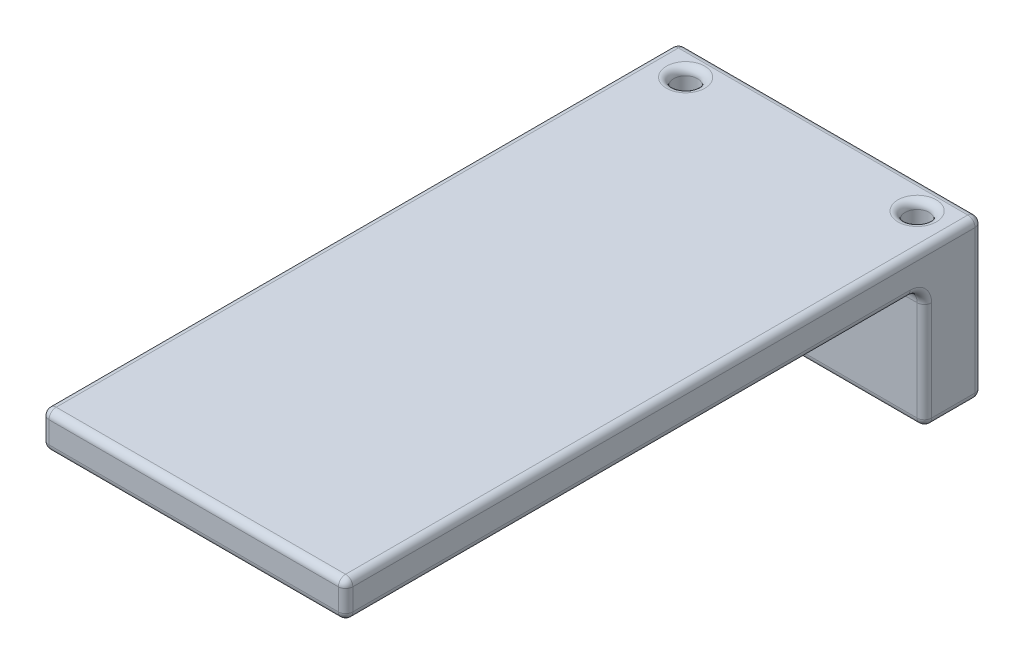
ISO-10303-21;
HEADER;
FILE_DESCRIPTION(('STEP AP214'),'2;1');
FILE_NAME('part.step','',(''),(''),'','','');
FILE_SCHEMA(('AUTOMOTIVE_DESIGN { 1 0 10303 214 1 1 1 1 }'));
ENDSEC;
DATA;
#1=APPLICATION_CONTEXT('core data for automotive mechanical design processes');
#2=APPLICATION_PROTOCOL_DEFINITION('international standard','automotive_design',2000,#1);
#3=PRODUCT_CONTEXT('',#1,'mechanical');
#4=PRODUCT('Part','Part','',(#3));
#5=PRODUCT_RELATED_PRODUCT_CATEGORY('part','',(#4));
#6=PRODUCT_DEFINITION_FORMATION('','',#4);
#7=PRODUCT_DEFINITION_CONTEXT('part definition',#1,'design');
#8=PRODUCT_DEFINITION('design','',#6,#7);
#9=PRODUCT_DEFINITION_SHAPE('','',#8);
#10=(LENGTH_UNIT() NAMED_UNIT(*) SI_UNIT(.MILLI.,.METRE.));
#11=(NAMED_UNIT(*) PLANE_ANGLE_UNIT() SI_UNIT($,.RADIAN.));
#12=(NAMED_UNIT(*) SI_UNIT($,.STERADIAN.) SOLID_ANGLE_UNIT());
#13=UNCERTAINTY_MEASURE_WITH_UNIT(LENGTH_MEASURE(1.E-05),#10,'distance_accuracy_value','');
#14=(GEOMETRIC_REPRESENTATION_CONTEXT(3) GLOBAL_UNCERTAINTY_ASSIGNED_CONTEXT((#13)) GLOBAL_UNIT_ASSIGNED_CONTEXT((#10,
#11,#12)) REPRESENTATION_CONTEXT('',''));
#15=CARTESIAN_POINT('',(0.,0.,0.));
#16=DIRECTION('',(0.,0.,1.));
#17=DIRECTION('',(1.,0.,0.));
#18=AXIS2_PLACEMENT_3D('',#15,#16,#17);
#19=CARTESIAN_POINT('',(21.,5.,40.));
#20=DIRECTION('',(-1.,0.,0.));
#21=DIRECTION('',(0.,0.,1.));
#22=AXIS2_PLACEMENT_3D('',#19,#20,#21);
#23=PLANE('',#22);
#24=DIRECTION('',(0.,0.,1.));
#25=VECTOR('',#24,1.);
#26=CARTESIAN_POINT('',(21.,-15.8,40.));
#27=LINE('',#26,#25);
#28=CARTESIAN_POINT('',(21.,-15.8,-41.));
#29=VERTEX_POINT('',#28);
#30=CARTESIAN_POINT('',(21.,-15.8,-47.));
#31=VERTEX_POINT('',#30);
#32=EDGE_CURVE('E322',#29,#31,#27,.F.);
#33=ORIENTED_EDGE('',*,*,#32,.T.);
#34=DIRECTION('',(0.,1.,0.));
#35=VECTOR('',#34,1.);
#36=CARTESIAN_POINT('',(21.,5.,-47.));
#37=LINE('',#36,#35);
#38=CARTESIAN_POINT('',(21.,4.,-47.));
#39=VERTEX_POINT('',#38);
#40=EDGE_CURVE('E324',#31,#39,#37,.T.);
#41=ORIENTED_EDGE('',*,*,#40,.T.);
#42=DIRECTION('',(0.,0.,-1.));
#43=VECTOR('',#42,1.);
#44=CARTESIAN_POINT('',(21.,4.,40.));
#45=LINE('',#44,#43);
#46=CARTESIAN_POINT('',(21.,4.,39.));
#47=VERTEX_POINT('',#46);
#48=EDGE_CURVE('E319',#39,#47,#45,.F.);
#49=ORIENTED_EDGE('',*,*,#48,.T.);
#50=DIRECTION('',(0.,-1.,0.));
#51=VECTOR('',#50,1.);
#52=CARTESIAN_POINT('',(21.,5.,39.));
#53=LINE('',#52,#51);
#54=CARTESIAN_POINT('',(21.,1.,39.));
#55=VERTEX_POINT('',#54);
#56=EDGE_CURVE('E311',#47,#55,#53,.T.);
#57=ORIENTED_EDGE('',*,*,#56,.T.);
#58=DIRECTION('',(0.,0.,-1.));
#59=VECTOR('',#58,1.);
#60=CARTESIAN_POINT('',(21.,1.,-38.));
#61=LINE('',#60,#59);
#62=CARTESIAN_POINT('',(21.,1.,-38.));
#63=VERTEX_POINT('',#62);
#64=EDGE_CURVE('E313',#55,#63,#61,.T.);
#65=ORIENTED_EDGE('',*,*,#64,.T.);
#66=CARTESIAN_POINT('',(21.,-2.,-38.));
#67=DIRECTION('',(-1.,0.,0.));
#68=DIRECTION('',(0.,0.,1.));
#69=AXIS2_PLACEMENT_3D('',#66,#67,#68);
#70=CIRCLE('',#69,3.);
#71=CARTESIAN_POINT('',(21.,-2.,-41.));
#72=VERTEX_POINT('',#71);
#73=EDGE_CURVE('E315',#63,#72,#70,.T.);
#74=ORIENTED_EDGE('',*,*,#73,.T.);
#75=DIRECTION('',(0.,1.,0.));
#76=VECTOR('',#75,1.);
#77=CARTESIAN_POINT('',(21.,-16.8,-41.));
#78=LINE('',#77,#76);
#79=EDGE_CURVE('E317',#72,#29,#78,.F.);
#80=ORIENTED_EDGE('',*,*,#79,.T.);
#81=EDGE_LOOP('',(#33,#41,#49,#57,#65,#74,#80));
#82=FACE_BOUND('',#81,.T.);
#83=ADVANCED_FACE('F39',(#82),#23,.F.);
#84=CARTESIAN_POINT('',(-21.,5.,40.));
#85=DIRECTION('',(1.,0.,0.));
#86=DIRECTION('',(0.,0.,-1.));
#87=AXIS2_PLACEMENT_3D('',#84,#85,#86);
#88=PLANE('',#87);
#89=DIRECTION('',(0.,1.,0.));
#90=VECTOR('',#89,1.);
#91=CARTESIAN_POINT('',(-21.,-16.8,-47.));
#92=LINE('',#91,#90);
#93=CARTESIAN_POINT('',(-21.,4.,-47.));
#94=VERTEX_POINT('',#93);
#95=CARTESIAN_POINT('',(-21.,-15.8,-47.));
#96=VERTEX_POINT('',#95);
#97=EDGE_CURVE('E268',#94,#96,#92,.F.);
#98=ORIENTED_EDGE('',*,*,#97,.T.);
#99=DIRECTION('',(0.,0.,-1.));
#100=VECTOR('',#99,1.);
#101=CARTESIAN_POINT('',(-21.,-15.8,40.));
#102=LINE('',#101,#100);
#103=CARTESIAN_POINT('',(-21.,-15.8,-41.));
#104=VERTEX_POINT('',#103);
#105=EDGE_CURVE('E275',#96,#104,#102,.F.);
#106=ORIENTED_EDGE('',*,*,#105,.T.);
#107=DIRECTION('',(0.,1.,0.));
#108=VECTOR('',#107,1.);
#109=CARTESIAN_POINT('',(-21.,-2.,-41.));
#110=LINE('',#109,#108);
#111=CARTESIAN_POINT('',(-21.,-2.,-41.));
#112=VERTEX_POINT('',#111);
#113=EDGE_CURVE('E272',#104,#112,#110,.T.);
#114=ORIENTED_EDGE('',*,*,#113,.T.);
#115=CARTESIAN_POINT('',(-21.,-2.,-38.));
#116=DIRECTION('',(1.,0.,0.));
#117=DIRECTION('',(0.,0.,-1.));
#118=AXIS2_PLACEMENT_3D('',#115,#116,#117);
#119=CIRCLE('',#118,3.);
#120=CARTESIAN_POINT('',(-21.,1.,-38.));
#121=VERTEX_POINT('',#120);
#122=EDGE_CURVE('E270',#112,#121,#119,.T.);
#123=ORIENTED_EDGE('',*,*,#122,.T.);
#124=DIRECTION('',(0.,0.,1.));
#125=VECTOR('',#124,1.);
#126=CARTESIAN_POINT('',(-21.,1.,40.));
#127=LINE('',#126,#125);
#128=CARTESIAN_POINT('',(-21.,1.,39.));
#129=VERTEX_POINT('',#128);
#130=EDGE_CURVE('E175',#121,#129,#127,.T.);
#131=ORIENTED_EDGE('',*,*,#130,.T.);
#132=DIRECTION('',(0.,-1.,0.));
#133=VECTOR('',#132,1.);
#134=CARTESIAN_POINT('',(-21.,5.,39.));
#135=LINE('',#134,#133);
#136=CARTESIAN_POINT('',(-21.,4.,39.));
#137=VERTEX_POINT('',#136);
#138=EDGE_CURVE('E169',#129,#137,#135,.F.);
#139=ORIENTED_EDGE('',*,*,#138,.T.);
#140=DIRECTION('',(0.,0.,1.));
#141=VECTOR('',#140,1.);
#142=CARTESIAN_POINT('',(-21.,4.,40.));
#143=LINE('',#142,#141);
#144=EDGE_CURVE('E172',#137,#94,#143,.F.);
#145=ORIENTED_EDGE('',*,*,#144,.T.);
#146=EDGE_LOOP('',(#98,#106,#114,#123,#131,#139,#145));
#147=FACE_BOUND('',#146,.T.);
#148=ADVANCED_FACE('F171',(#147),#88,.F.);
#149=CARTESIAN_POINT('',(-21.,5.,40.));
#150=DIRECTION('',(0.,0.,-1.));
#151=DIRECTION('',(-1.,0.,0.));
#152=AXIS2_PLACEMENT_3D('',#149,#150,#151);
#153=PLANE('',#152);
#154=DIRECTION('',(1.,0.,0.));
#155=VECTOR('',#154,1.);
#156=CARTESIAN_POINT('',(-21.,4.,40.));
#157=LINE('',#156,#155);
#158=CARTESIAN_POINT('',(20.,4.,40.));
#159=VERTEX_POINT('',#158);
#160=CARTESIAN_POINT('',(-20.,4.,40.));
#161=VERTEX_POINT('',#160);
#162=EDGE_CURVE('E48',#159,#161,#157,.F.);
#163=ORIENTED_EDGE('',*,*,#162,.T.);
#164=DIRECTION('',(0.,-1.,0.));
#165=VECTOR('',#164,1.);
#166=CARTESIAN_POINT('',(-20.,5.,40.));
#167=LINE('',#166,#165);
#168=CARTESIAN_POINT('',(-20.,1.,40.));
#169=VERTEX_POINT('',#168);
#170=EDGE_CURVE('E11',#161,#169,#167,.T.);
#171=ORIENTED_EDGE('',*,*,#170,.T.);
#172=DIRECTION('',(1.,0.,0.));
#173=VECTOR('',#172,1.);
#174=CARTESIAN_POINT('',(21.,1.,40.));
#175=LINE('',#174,#173);
#176=CARTESIAN_POINT('',(20.,1.,40.));
#177=VERTEX_POINT('',#176);
#178=EDGE_CURVE('E359',#169,#177,#175,.T.);
#179=ORIENTED_EDGE('',*,*,#178,.T.);
#180=DIRECTION('',(0.,-1.,0.));
#181=VECTOR('',#180,1.);
#182=CARTESIAN_POINT('',(20.,5.,40.));
#183=LINE('',#182,#181);
#184=EDGE_CURVE('E59',#177,#159,#183,.F.);
#185=ORIENTED_EDGE('',*,*,#184,.T.);
#186=EDGE_LOOP('',(#163,#171,#179,#185));
#187=FACE_BOUND('',#186,.T.);
#188=ADVANCED_FACE('F469',(#187),#153,.F.);
#189=CARTESIAN_POINT('',(0.,5.,0.));
#190=DIRECTION('',(0.,-1.,0.));
#191=DIRECTION('',(0.,0.,-1.));
#192=AXIS2_PLACEMENT_3D('',#189,#190,#191);
#193=PLANE('',#192);
#194=CARTESIAN_POINT('',(16.,5.,-44.));
#195=DIRECTION('',(0.,-1.,0.));
#196=DIRECTION('',(0.,0.,-1.));
#197=AXIS2_PLACEMENT_3D('',#194,#195,#196);
#198=CIRCLE('',#197,2.65);
#199=CARTESIAN_POINT('',(16.,5.,-46.65));
#200=VERTEX_POINT('',#199);
#201=EDGE_CURVE('E299',#200,#200,#198,.T.);
#202=ORIENTED_EDGE('',*,*,#201,.T.);
#203=EDGE_LOOP('',(#202));
#204=FACE_BOUND('',#203,.T.);
#205=CARTESIAN_POINT('',(-16.,5.,-44.));
#206=DIRECTION('',(0.,-1.,0.));
#207=DIRECTION('',(0.,0.,-1.));
#208=AXIS2_PLACEMENT_3D('',#205,#206,#207);
#209=CIRCLE('',#208,2.65);
#210=CARTESIAN_POINT('',(-16.,5.,-46.65));
#211=VERTEX_POINT('',#210);
#212=EDGE_CURVE('E296',#211,#211,#209,.T.);
#213=ORIENTED_EDGE('',*,*,#212,.T.);
#214=EDGE_LOOP('',(#213));
#215=FACE_BOUND('',#214,.T.);
#216=DIRECTION('',(0.,0.,-1.));
#217=VECTOR('',#216,1.);
#218=CARTESIAN_POINT('',(20.,5.,0.));
#219=LINE('',#218,#217);
#220=CARTESIAN_POINT('',(20.,5.,39.));
#221=VERTEX_POINT('',#220);
#222=CARTESIAN_POINT('',(20.,5.,-47.));
#223=VERTEX_POINT('',#222);
#224=EDGE_CURVE('E291',#221,#223,#219,.T.);
#225=ORIENTED_EDGE('',*,*,#224,.T.);
#226=DIRECTION('',(-1.,0.,0.));
#227=VECTOR('',#226,1.);
#228=CARTESIAN_POINT('',(-21.,5.,-47.));
#229=LINE('',#228,#227);
#230=CARTESIAN_POINT('',(-20.,5.,-47.));
#231=VERTEX_POINT('',#230);
#232=EDGE_CURVE('E293',#223,#231,#229,.T.);
#233=ORIENTED_EDGE('',*,*,#232,.T.);
#234=DIRECTION('',(0.,0.,1.));
#235=VECTOR('',#234,1.);
#236=CARTESIAN_POINT('',(-20.,5.,0.));
#237=LINE('',#236,#235);
#238=CARTESIAN_POINT('',(-20.,5.,39.));
#239=VERTEX_POINT('',#238);
#240=EDGE_CURVE('E287',#231,#239,#237,.T.);
#241=ORIENTED_EDGE('',*,*,#240,.T.);
#242=DIRECTION('',(1.,0.,0.));
#243=VECTOR('',#242,1.);
#244=CARTESIAN_POINT('',(0.,5.,39.));
#245=LINE('',#244,#243);
#246=EDGE_CURVE('E289',#239,#221,#245,.T.);
#247=ORIENTED_EDGE('',*,*,#246,.T.);
#248=EDGE_LOOP('',(#225,#233,#241,#247));
#249=FACE_BOUND('',#248,.T.);
#250=ADVANCED_FACE('F449',(#204,#215,#249),#193,.F.);
#251=CARTESIAN_POINT('',(0.,0.,0.));
#252=DIRECTION('',(0.,-1.,0.));
#253=DIRECTION('',(0.,0.,-1.));
#254=AXIS2_PLACEMENT_3D('',#251,#252,#253);
#255=PLANE('',#254);
#256=DIRECTION('',(-1.,0.,0.));
#257=VECTOR('',#256,1.);
#258=CARTESIAN_POINT('',(21.,0.,-38.));
#259=LINE('',#258,#257);
#260=CARTESIAN_POINT('',(-20.,0.,-38.));
#261=VERTEX_POINT('',#260);
#262=CARTESIAN_POINT('',(20.,0.,-38.));
#263=VERTEX_POINT('',#262);
#264=EDGE_CURVE('E190',#261,#263,#259,.F.);
#265=ORIENTED_EDGE('',*,*,#264,.T.);
#266=DIRECTION('',(0.,0.,-1.));
#267=VECTOR('',#266,1.);
#268=CARTESIAN_POINT('',(20.,0.,40.));
#269=LINE('',#268,#267);
#270=CARTESIAN_POINT('',(20.,0.,39.));
#271=VERTEX_POINT('',#270);
#272=EDGE_CURVE('E357',#263,#271,#269,.F.);
#273=ORIENTED_EDGE('',*,*,#272,.T.);
#274=DIRECTION('',(1.,0.,0.));
#275=VECTOR('',#274,1.);
#276=CARTESIAN_POINT('',(-21.,0.,39.));
#277=LINE('',#276,#275);
#278=CARTESIAN_POINT('',(-20.,0.,39.));
#279=VERTEX_POINT('',#278);
#280=EDGE_CURVE('E353',#271,#279,#277,.F.);
#281=ORIENTED_EDGE('',*,*,#280,.T.);
#282=DIRECTION('',(0.,0.,1.));
#283=VECTOR('',#282,1.);
#284=CARTESIAN_POINT('',(-20.,0.,-38.));
#285=LINE('',#284,#283);
#286=EDGE_CURVE('E355',#279,#261,#285,.F.);
#287=ORIENTED_EDGE('',*,*,#286,.T.);
#288=EDGE_LOOP('',(#265,#273,#281,#287));
#289=FACE_BOUND('',#288,.T.);
#290=ADVANCED_FACE('F886',(#289),#255,.T.);
#291=CARTESIAN_POINT('',(-21.,-59.5551166528639,-40.));
#292=DIRECTION('',(0.,0.,1.));
#293=DIRECTION('',(1.,0.,0.));
#294=AXIS2_PLACEMENT_3D('',#291,#292,#293);
#295=PLANE('',#294);
#296=DIRECTION('',(-1.,0.,0.));
#297=VECTOR('',#296,1.);
#298=CARTESIAN_POINT('',(-21.,-2.,-40.));
#299=LINE('',#298,#297);
#300=CARTESIAN_POINT('',(20.,-2.,-40.));
#301=VERTEX_POINT('',#300);
#302=CARTESIAN_POINT('',(-20.,-2.,-40.));
#303=VERTEX_POINT('',#302);
#304=EDGE_CURVE('E253',#301,#303,#299,.T.);
#305=ORIENTED_EDGE('',*,*,#304,.T.);
#306=DIRECTION('',(0.,1.,0.));
#307=VECTOR('',#306,1.);
#308=CARTESIAN_POINT('',(-20.,-16.8,-40.));
#309=LINE('',#308,#307);
#310=CARTESIAN_POINT('',(-20.,-15.8,-40.));
#311=VERTEX_POINT('',#310);
#312=EDGE_CURVE('E281',#303,#311,#309,.F.);
#313=ORIENTED_EDGE('',*,*,#312,.T.);
#314=DIRECTION('',(-1.,0.,0.));
#315=VECTOR('',#314,1.);
#316=CARTESIAN_POINT('',(21.,-15.8,-40.));
#317=LINE('',#316,#315);
#318=CARTESIAN_POINT('',(20.,-15.8,-40.));
#319=VERTEX_POINT('',#318);
#320=EDGE_CURVE('E277',#311,#319,#317,.F.);
#321=ORIENTED_EDGE('',*,*,#320,.T.);
#322=DIRECTION('',(0.,1.,0.));
#323=VECTOR('',#322,1.);
#324=CARTESIAN_POINT('',(20.,-2.,-40.));
#325=LINE('',#324,#323);
#326=EDGE_CURVE('E279',#319,#301,#325,.T.);
#327=ORIENTED_EDGE('',*,*,#326,.T.);
#328=EDGE_LOOP('',(#305,#313,#321,#327));
#329=FACE_BOUND('',#328,.T.);
#330=ADVANCED_FACE('F876',(#329),#295,.T.);
#331=CARTESIAN_POINT('',(-21.,-59.5551166528639,-48.));
#332=DIRECTION('',(0.,0.,-1.));
#333=DIRECTION('',(-1.,0.,0.));
#334=AXIS2_PLACEMENT_3D('',#331,#332,#333);
#335=PLANE('',#334);
#336=DIRECTION('',(0.,1.,0.));
#337=VECTOR('',#336,1.);
#338=CARTESIAN_POINT('',(-20.,5.,-48.));
#339=LINE('',#338,#337);
#340=CARTESIAN_POINT('',(-20.,-15.8,-48.));
#341=VERTEX_POINT('',#340);
#342=CARTESIAN_POINT('',(-20.,4.,-48.));
#343=VERTEX_POINT('',#342);
#344=EDGE_CURVE('E306',#341,#343,#339,.T.);
#345=ORIENTED_EDGE('',*,*,#344,.T.);
#346=DIRECTION('',(-1.,0.,0.));
#347=VECTOR('',#346,1.);
#348=CARTESIAN_POINT('',(21.,4.,-48.));
#349=LINE('',#348,#347);
#350=CARTESIAN_POINT('',(20.,4.,-48.));
#351=VERTEX_POINT('',#350);
#352=EDGE_CURVE('E308',#343,#351,#349,.F.);
#353=ORIENTED_EDGE('',*,*,#352,.T.);
#354=DIRECTION('',(0.,1.,0.));
#355=VECTOR('',#354,1.);
#356=CARTESIAN_POINT('',(20.,-16.8,-48.));
#357=LINE('',#356,#355);
#358=CARTESIAN_POINT('',(20.,-15.8,-48.));
#359=VERTEX_POINT('',#358);
#360=EDGE_CURVE('E304',#351,#359,#357,.F.);
#361=ORIENTED_EDGE('',*,*,#360,.T.);
#362=DIRECTION('',(1.,0.,0.));
#363=VECTOR('',#362,1.);
#364=CARTESIAN_POINT('',(-21.,-15.8,-48.));
#365=LINE('',#364,#363);
#366=EDGE_CURVE('E302',#359,#341,#365,.F.);
#367=ORIENTED_EDGE('',*,*,#366,.T.);
#368=EDGE_LOOP('',(#345,#353,#361,#367));
#369=FACE_BOUND('',#368,.T.);
#370=ADVANCED_FACE('F434',(#369),#335,.T.);
#371=CARTESIAN_POINT('',(16.,-59.5551166528639,-44.));
#372=DIRECTION('',(0.,1.,0.));
#373=DIRECTION('',(0.,0.,1.));
#374=AXIS2_PLACEMENT_3D('',#371,#372,#373);
#375=CYLINDRICAL_SURFACE('',#374,1.65);
#376=CARTESIAN_POINT('',(16.,-15.8,-44.));
#377=DIRECTION('',(0.,1.,0.));
#378=DIRECTION('',(0.,0.,1.));
#379=AXIS2_PLACEMENT_3D('',#376,#377,#378);
#380=CIRCLE('',#379,1.65);
#381=CARTESIAN_POINT('',(16.,-15.8,-42.35));
#382=VERTEX_POINT('',#381);
#383=EDGE_CURVE('E329',#382,#382,#380,.F.);
#384=ORIENTED_EDGE('',*,*,#383,.T.);
#385=EDGE_LOOP('',(#384));
#386=FACE_BOUND('',#385,.T.);
#387=CARTESIAN_POINT('',(16.,4.,-44.));
#388=DIRECTION('',(0.,-1.,0.));
#389=DIRECTION('',(0.,0.,-1.));
#390=AXIS2_PLACEMENT_3D('',#387,#388,#389);
#391=CIRCLE('',#390,1.65);
#392=CARTESIAN_POINT('',(16.,4.,-45.65));
#393=VERTEX_POINT('',#392);
#394=EDGE_CURVE('E326',#393,#393,#391,.F.);
#395=ORIENTED_EDGE('',*,*,#394,.T.);
#396=EDGE_LOOP('',(#395));
#397=FACE_BOUND('',#396,.T.);
#398=ADVANCED_FACE('F855',(#386,#397),#375,.F.);
#399=CARTESIAN_POINT('',(-16.,-59.5551166528639,-44.));
#400=DIRECTION('',(0.,1.,0.));
#401=DIRECTION('',(0.,0.,1.));
#402=AXIS2_PLACEMENT_3D('',#399,#400,#401);
#403=CYLINDRICAL_SURFACE('',#402,1.65);
#404=CARTESIAN_POINT('',(-16.,-15.8,-44.));
#405=DIRECTION('',(0.,1.,0.));
#406=DIRECTION('',(0.,0.,1.));
#407=AXIS2_PLACEMENT_3D('',#404,#405,#406);
#408=CIRCLE('',#407,1.65);
#409=CARTESIAN_POINT('',(-16.,-15.8,-42.35));
#410=VERTEX_POINT('',#409);
#411=EDGE_CURVE('E350',#410,#410,#408,.F.);
#412=ORIENTED_EDGE('',*,*,#411,.T.);
#413=EDGE_LOOP('',(#412));
#414=FACE_BOUND('',#413,.T.);
#415=CARTESIAN_POINT('',(-16.,4.,-44.));
#416=DIRECTION('',(0.,-1.,0.));
#417=DIRECTION('',(0.,0.,-1.));
#418=AXIS2_PLACEMENT_3D('',#415,#416,#417);
#419=CIRCLE('',#418,1.65);
#420=CARTESIAN_POINT('',(-16.,4.,-45.65));
#421=VERTEX_POINT('',#420);
#422=EDGE_CURVE('E347',#421,#421,#419,.F.);
#423=ORIENTED_EDGE('',*,*,#422,.T.);
#424=EDGE_LOOP('',(#423));
#425=FACE_BOUND('',#424,.T.);
#426=ADVANCED_FACE('F844',(#414,#425),#403,.F.);
#427=CARTESIAN_POINT('',(0.,-16.8,9.99999999999999));
#428=DIRECTION('',(0.,1.,0.));
#429=DIRECTION('',(0.,0.,-1.));
#430=AXIS2_PLACEMENT_3D('',#427,#428,#429);
#431=PLANE('',#430);
#432=CARTESIAN_POINT('',(16.,-16.8,-44.));
#433=DIRECTION('',(0.,1.,0.));
#434=DIRECTION('',(0.,0.,1.));
#435=AXIS2_PLACEMENT_3D('',#432,#433,#434);
#436=CIRCLE('',#435,2.65);
#437=CARTESIAN_POINT('',(16.,-16.8,-41.35));
#438=VERTEX_POINT('',#437);
#439=EDGE_CURVE('E344',#438,#438,#436,.T.);
#440=ORIENTED_EDGE('',*,*,#439,.T.);
#441=EDGE_LOOP('',(#440));
#442=FACE_BOUND('',#441,.T.);
#443=CARTESIAN_POINT('',(-16.,-16.8,-44.));
#444=DIRECTION('',(0.,1.,0.));
#445=DIRECTION('',(0.,0.,1.));
#446=AXIS2_PLACEMENT_3D('',#443,#444,#445);
#447=CIRCLE('',#446,2.65);
#448=CARTESIAN_POINT('',(-16.,-16.8,-41.35));
#449=VERTEX_POINT('',#448);
#450=EDGE_CURVE('E341',#449,#449,#447,.T.);
#451=ORIENTED_EDGE('',*,*,#450,.T.);
#452=EDGE_LOOP('',(#451));
#453=FACE_BOUND('',#452,.T.);
#454=DIRECTION('',(0.,0.,1.));
#455=VECTOR('',#454,1.);
#456=CARTESIAN_POINT('',(20.,-16.8,9.99999999999999));
#457=LINE('',#456,#455);
#458=CARTESIAN_POINT('',(20.,-16.8,-47.));
#459=VERTEX_POINT('',#458);
#460=CARTESIAN_POINT('',(20.,-16.8,-41.));
#461=VERTEX_POINT('',#460);
#462=EDGE_CURVE('E336',#459,#461,#457,.T.);
#463=ORIENTED_EDGE('',*,*,#462,.T.);
#464=DIRECTION('',(-1.,0.,0.));
#465=VECTOR('',#464,1.);
#466=CARTESIAN_POINT('',(-21.,-16.8,-41.));
#467=LINE('',#466,#465);
#468=CARTESIAN_POINT('',(-20.,-16.8,-41.));
#469=VERTEX_POINT('',#468);
#470=EDGE_CURVE('E338',#461,#469,#467,.T.);
#471=ORIENTED_EDGE('',*,*,#470,.T.);
#472=DIRECTION('',(0.,0.,-1.));
#473=VECTOR('',#472,1.);
#474=CARTESIAN_POINT('',(-20.,-16.8,9.99999999999999));
#475=LINE('',#474,#473);
#476=CARTESIAN_POINT('',(-20.,-16.8,-47.));
#477=VERTEX_POINT('',#476);
#478=EDGE_CURVE('E332',#469,#477,#475,.T.);
#479=ORIENTED_EDGE('',*,*,#478,.T.);
#480=DIRECTION('',(1.,0.,0.));
#481=VECTOR('',#480,1.);
#482=CARTESIAN_POINT('',(21.,-16.8,-47.));
#483=LINE('',#482,#481);
#484=EDGE_CURVE('E334',#477,#459,#483,.T.);
#485=ORIENTED_EDGE('',*,*,#484,.T.);
#486=EDGE_LOOP('',(#463,#471,#479,#485));
#487=FACE_BOUND('',#486,.T.);
#488=ADVANCED_FACE('F412',(#442,#453,#487),#431,.F.);
#489=CARTESIAN_POINT('',(-21.,-2.,-38.));
#490=DIRECTION('',(1.,0.,0.));
#491=DIRECTION('',(0.,0.,-1.));
#492=AXIS2_PLACEMENT_3D('',#489,#490,#491);
#493=CYLINDRICAL_SURFACE('',#492,2.);
#494=ORIENTED_EDGE('',*,*,#264,.F.);
#495=CARTESIAN_POINT('',(-20.,-2.,-38.));
#496=DIRECTION('',(1.,0.,0.));
#497=DIRECTION('',(0.,0.,-1.));
#498=AXIS2_PLACEMENT_3D('',#495,#496,#497);
#499=CIRCLE('',#498,2.);
#500=EDGE_CURVE('E285',#261,#303,#499,.F.);
#501=ORIENTED_EDGE('',*,*,#500,.T.);
#502=ORIENTED_EDGE('',*,*,#304,.F.);
#503=CARTESIAN_POINT('',(20.,-2.,-38.));
#504=DIRECTION('',(-1.,0.,0.));
#505=DIRECTION('',(0.,0.,1.));
#506=AXIS2_PLACEMENT_3D('',#503,#504,#505);
#507=CIRCLE('',#506,2.);
#508=EDGE_CURVE('E283',#301,#263,#507,.F.);
#509=ORIENTED_EDGE('',*,*,#508,.T.);
#510=EDGE_LOOP('',(#494,#501,#502,#509));
#511=FACE_BOUND('',#510,.T.);
#512=ADVANCED_FACE('F462',(#511),#493,.F.);
#513=CARTESIAN_POINT('',(20.,4.,0.));
#514=DIRECTION('',(0.,0.,-1.));
#515=DIRECTION('',(-1.,0.,0.));
#516=AXIS2_PLACEMENT_3D('',#513,#514,#515);
#517=CYLINDRICAL_SURFACE('',#516,1.);
#518=CARTESIAN_POINT('',(20.,4.,-47.));
#519=DIRECTION('',(0.,0.,-1.));
#520=DIRECTION('',(-1.,0.,0.));
#521=AXIS2_PLACEMENT_3D('',#518,#519,#520);
#522=CIRCLE('',#521,1.);
#523=EDGE_CURVE('E43',#223,#39,#522,.T.);
#524=ORIENTED_EDGE('',*,*,#523,.F.);
#525=ORIENTED_EDGE('',*,*,#224,.F.);
#526=CARTESIAN_POINT('',(20.,4.,39.));
#527=DIRECTION('',(0.,0.,1.));
#528=DIRECTION('',(1.,0.,0.));
#529=AXIS2_PLACEMENT_3D('',#526,#527,#528);
#530=CIRCLE('',#529,1.);
#531=EDGE_CURVE('E246',#47,#221,#530,.T.);
#532=ORIENTED_EDGE('',*,*,#531,.F.);
#533=ORIENTED_EDGE('',*,*,#48,.F.);
#534=EDGE_LOOP('',(#524,#525,#532,#533));
#535=FACE_BOUND('',#534,.T.);
#536=ADVANCED_FACE('F452',(#535),#517,.T.);
#537=CARTESIAN_POINT('',(20.,4.,-47.));
#538=DIRECTION('',(1.,0.,0.));
#539=DIRECTION('',(0.,0.,-1.));
#540=AXIS2_PLACEMENT_3D('',#537,#538,#539);
#541=SPHERICAL_SURFACE('',#540,1.);
#542=CARTESIAN_POINT('',(20.,4.,-47.));
#543=DIRECTION('',(1.,0.,0.));
#544=DIRECTION('',(0.,0.,-1.));
#545=AXIS2_PLACEMENT_3D('',#542,#543,#544);
#546=CIRCLE('',#545,1.);
#547=EDGE_CURVE('E241',#223,#351,#546,.F.);
#548=ORIENTED_EDGE('',*,*,#547,.F.);
#549=ORIENTED_EDGE('',*,*,#523,.T.);
#550=CARTESIAN_POINT('',(20.,4.,-47.));
#551=DIRECTION('',(0.,1.,0.));
#552=DIRECTION('',(0.,0.,1.));
#553=AXIS2_PLACEMENT_3D('',#550,#551,#552);
#554=CIRCLE('',#553,1.);
#555=EDGE_CURVE('E244',#351,#39,#554,.F.);
#556=ORIENTED_EDGE('',*,*,#555,.F.);
#557=EDGE_LOOP('',(#548,#549,#556));
#558=FACE_BOUND('',#557,.T.);
#559=ADVANCED_FACE('F453',(#558),#541,.T.);
#560=CARTESIAN_POINT('',(20.,4.,39.));
#561=DIRECTION('',(0.,1.,0.));
#562=DIRECTION('',(0.,0.,1.));
#563=AXIS2_PLACEMENT_3D('',#560,#561,#562);
#564=SPHERICAL_SURFACE('',#563,1.);
#565=CARTESIAN_POINT('',(20.,4.,39.));
#566=DIRECTION('',(0.,1.,0.));
#567=DIRECTION('',(0.,0.,1.));
#568=AXIS2_PLACEMENT_3D('',#565,#566,#567);
#569=CIRCLE('',#568,1.);
#570=EDGE_CURVE('E236',#47,#159,#569,.F.);
#571=ORIENTED_EDGE('',*,*,#570,.F.);
#572=ORIENTED_EDGE('',*,*,#531,.T.);
#573=CARTESIAN_POINT('',(20.,4.,39.));
#574=DIRECTION('',(1.,0.,0.));
#575=DIRECTION('',(0.,0.,-1.));
#576=AXIS2_PLACEMENT_3D('',#573,#574,#575);
#577=CIRCLE('',#576,1.);
#578=EDGE_CURVE('E238',#159,#221,#577,.F.);
#579=ORIENTED_EDGE('',*,*,#578,.F.);
#580=EDGE_LOOP('',(#571,#572,#579));
#581=FACE_BOUND('',#580,.T.);
#582=ADVANCED_FACE('F455',(#581),#564,.T.);
#583=CARTESIAN_POINT('',(20.,5.,-47.));
#584=DIRECTION('',(0.,-1.,0.));
#585=DIRECTION('',(0.,0.,-1.));
#586=AXIS2_PLACEMENT_3D('',#583,#584,#585);
#587=CYLINDRICAL_SURFACE('',#586,1.);
#588=ORIENTED_EDGE('',*,*,#555,.T.);
#589=ORIENTED_EDGE('',*,*,#40,.F.);
#590=CARTESIAN_POINT('',(20.,-15.8,-47.));
#591=DIRECTION('',(0.,-1.,0.));
#592=DIRECTION('',(0.,0.,-1.));
#593=AXIS2_PLACEMENT_3D('',#590,#591,#592);
#594=CIRCLE('',#593,1.);
#595=EDGE_CURVE('E230',#359,#31,#594,.T.);
#596=ORIENTED_EDGE('',*,*,#595,.F.);
#597=ORIENTED_EDGE('',*,*,#360,.F.);
#598=EDGE_LOOP('',(#588,#589,#596,#597));
#599=FACE_BOUND('',#598,.T.);
#600=ADVANCED_FACE('F424',(#599),#587,.T.);
#601=CARTESIAN_POINT('',(0.,4.,-47.));
#602=DIRECTION('',(1.,0.,0.));
#603=DIRECTION('',(0.,0.,-1.));
#604=AXIS2_PLACEMENT_3D('',#601,#602,#603);
#605=CYLINDRICAL_SURFACE('',#604,1.);
#606=ORIENTED_EDGE('',*,*,#547,.T.);
#607=ORIENTED_EDGE('',*,*,#352,.F.);
#608=CARTESIAN_POINT('',(-20.,4.,-47.));
#609=DIRECTION('',(-1.,0.,0.));
#610=DIRECTION('',(0.,0.,1.));
#611=AXIS2_PLACEMENT_3D('',#608,#609,#610);
#612=CIRCLE('',#611,1.);
#613=EDGE_CURVE('E227',#231,#343,#612,.T.);
#614=ORIENTED_EDGE('',*,*,#613,.F.);
#615=ORIENTED_EDGE('',*,*,#232,.F.);
#616=EDGE_LOOP('',(#606,#607,#614,#615));
#617=FACE_BOUND('',#616,.T.);
#618=ADVANCED_FACE('F446',(#617),#605,.T.);
#619=CARTESIAN_POINT('',(-20.,4.,0.));
#620=DIRECTION('',(0.,0.,1.));
#621=DIRECTION('',(1.,0.,0.));
#622=AXIS2_PLACEMENT_3D('',#619,#620,#621);
#623=CYLINDRICAL_SURFACE('',#622,1.);
#624=CARTESIAN_POINT('',(-20.,4.,39.));
#625=DIRECTION('',(0.,0.,1.));
#626=DIRECTION('',(1.,0.,0.));
#627=AXIS2_PLACEMENT_3D('',#624,#625,#626);
#628=CIRCLE('',#627,1.);
#629=EDGE_CURVE('E186',#239,#137,#628,.T.);
#630=ORIENTED_EDGE('',*,*,#629,.F.);
#631=ORIENTED_EDGE('',*,*,#240,.F.);
#632=CARTESIAN_POINT('',(-20.,4.,-47.));
#633=DIRECTION('',(0.,0.,-1.));
#634=DIRECTION('',(-1.,0.,0.));
#635=AXIS2_PLACEMENT_3D('',#632,#633,#634);
#636=CIRCLE('',#635,1.);
#637=EDGE_CURVE('E188',#94,#231,#636,.T.);
#638=ORIENTED_EDGE('',*,*,#637,.F.);
#639=ORIENTED_EDGE('',*,*,#144,.F.);
#640=EDGE_LOOP('',(#630,#631,#638,#639));
#641=FACE_BOUND('',#640,.T.);
#642=ADVANCED_FACE('F184',(#641),#623,.T.);
#643=CARTESIAN_POINT('',(0.,4.,39.));
#644=DIRECTION('',(1.,0.,0.));
#645=DIRECTION('',(0.,0.,-1.));
#646=AXIS2_PLACEMENT_3D('',#643,#644,#645);
#647=CYLINDRICAL_SURFACE('',#646,1.);
#648=ORIENTED_EDGE('',*,*,#578,.T.);
#649=ORIENTED_EDGE('',*,*,#246,.F.);
#650=CARTESIAN_POINT('',(-20.,4.,39.));
#651=DIRECTION('',(-1.,0.,0.));
#652=DIRECTION('',(0.,0.,1.));
#653=AXIS2_PLACEMENT_3D('',#650,#651,#652);
#654=CIRCLE('',#653,1.);
#655=EDGE_CURVE('E197',#161,#239,#654,.T.);
#656=ORIENTED_EDGE('',*,*,#655,.F.);
#657=ORIENTED_EDGE('',*,*,#162,.F.);
#658=EDGE_LOOP('',(#648,#649,#656,#657));
#659=FACE_BOUND('',#658,.T.);
#660=ADVANCED_FACE('F545',(#659),#647,.T.);
#661=CARTESIAN_POINT('',(20.,5.,39.));
#662=DIRECTION('',(0.,-1.,0.));
#663=DIRECTION('',(0.,0.,-1.));
#664=AXIS2_PLACEMENT_3D('',#661,#662,#663);
#665=CYLINDRICAL_SURFACE('',#664,1.);
#666=ORIENTED_EDGE('',*,*,#570,.T.);
#667=ORIENTED_EDGE('',*,*,#184,.F.);
#668=CARTESIAN_POINT('',(20.,1.,39.));
#669=DIRECTION('',(0.,-1.,0.));
#670=DIRECTION('',(0.,0.,-1.));
#671=AXIS2_PLACEMENT_3D('',#668,#669,#670);
#672=CIRCLE('',#671,1.);
#673=EDGE_CURVE('E222',#55,#177,#672,.T.);
#674=ORIENTED_EDGE('',*,*,#673,.F.);
#675=ORIENTED_EDGE('',*,*,#56,.F.);
#676=EDGE_LOOP('',(#666,#667,#674,#675));
#677=FACE_BOUND('',#676,.T.);
#678=ADVANCED_FACE('F541',(#677),#665,.T.);
#679=CARTESIAN_POINT('',(20.,1.,40.));
#680=DIRECTION('',(0.,0.,1.));
#681=DIRECTION('',(1.,0.,0.));
#682=AXIS2_PLACEMENT_3D('',#679,#680,#681);
#683=CYLINDRICAL_SURFACE('',#682,1.);
#684=CARTESIAN_POINT('',(20.,1.,39.));
#685=DIRECTION('',(0.,0.,1.));
#686=DIRECTION('',(1.,0.,0.));
#687=AXIS2_PLACEMENT_3D('',#684,#685,#686);
#688=CIRCLE('',#687,1.);
#689=EDGE_CURVE('E219',#271,#55,#688,.T.);
#690=ORIENTED_EDGE('',*,*,#689,.F.);
#691=ORIENTED_EDGE('',*,*,#272,.F.);
#692=CARTESIAN_POINT('',(20.,1.,-38.));
#693=DIRECTION('',(0.,0.,-1.));
#694=DIRECTION('',(-1.,0.,0.));
#695=AXIS2_PLACEMENT_3D('',#692,#693,#694);
#696=CIRCLE('',#695,1.);
#697=EDGE_CURVE('E233',#63,#263,#696,.T.);
#698=ORIENTED_EDGE('',*,*,#697,.F.);
#699=ORIENTED_EDGE('',*,*,#64,.F.);
#700=EDGE_LOOP('',(#690,#691,#698,#699));
#701=FACE_BOUND('',#700,.T.);
#702=ADVANCED_FACE('F537',(#701),#683,.T.);
#703=CARTESIAN_POINT('',(20.,-2.,-38.));
#704=DIRECTION('',(-1.,0.,0.));
#705=DIRECTION('',(0.,0.,1.));
#706=AXIS2_PLACEMENT_3D('',#703,#704,#705);
#707=TOROIDAL_SURFACE('',#706,3.,1.);
#708=ORIENTED_EDGE('',*,*,#697,.T.);
#709=ORIENTED_EDGE('',*,*,#508,.F.);
#710=CARTESIAN_POINT('',(20.,-2.,-41.));
#711=DIRECTION('',(0.,-1.,0.));
#712=DIRECTION('',(0.,0.,-1.));
#713=AXIS2_PLACEMENT_3D('',#710,#711,#712);
#714=CIRCLE('',#713,1.);
#715=EDGE_CURVE('E216',#72,#301,#714,.T.);
#716=ORIENTED_EDGE('',*,*,#715,.F.);
#717=ORIENTED_EDGE('',*,*,#73,.F.);
#718=EDGE_LOOP('',(#708,#709,#716,#717));
#719=FACE_BOUND('',#718,.T.);
#720=ADVANCED_FACE('F534',(#719),#707,.T.);
#721=CARTESIAN_POINT('',(20.,-15.8,-47.));
#722=DIRECTION('',(1.,0.,0.));
#723=DIRECTION('',(0.,0.,-1.));
#724=AXIS2_PLACEMENT_3D('',#721,#722,#723);
#725=SPHERICAL_SURFACE('',#724,1.);
#726=CARTESIAN_POINT('',(20.,-15.8,-47.));
#727=DIRECTION('',(1.,0.,0.));
#728=DIRECTION('',(0.,0.,-1.));
#729=AXIS2_PLACEMENT_3D('',#726,#727,#728);
#730=CIRCLE('',#729,1.);
#731=EDGE_CURVE('E204',#359,#459,#730,.F.);
#732=ORIENTED_EDGE('',*,*,#731,.F.);
#733=ORIENTED_EDGE('',*,*,#595,.T.);
#734=CARTESIAN_POINT('',(20.,-15.8,-47.));
#735=DIRECTION('',(0.,0.,-1.));
#736=DIRECTION('',(0.,1.,0.));
#737=AXIS2_PLACEMENT_3D('',#734,#735,#736);
#738=CIRCLE('',#737,1.);
#739=EDGE_CURVE('E213',#459,#31,#738,.F.);
#740=ORIENTED_EDGE('',*,*,#739,.F.);
#741=EDGE_LOOP('',(#732,#733,#740));
#742=FACE_BOUND('',#741,.T.);
#743=ADVANCED_FACE('F427',(#742),#725,.T.);
#744=CARTESIAN_POINT('',(-20.,4.,-47.));
#745=DIRECTION('',(0.,1.,0.));
#746=DIRECTION('',(0.,0.,1.));
#747=AXIS2_PLACEMENT_3D('',#744,#745,#746);
#748=SPHERICAL_SURFACE('',#747,1.);
#749=ORIENTED_EDGE('',*,*,#637,.T.);
#750=ORIENTED_EDGE('',*,*,#613,.T.);
#751=CARTESIAN_POINT('',(-20.,4.,-47.));
#752=DIRECTION('',(0.,1.,0.));
#753=DIRECTION('',(0.,0.,1.));
#754=AXIS2_PLACEMENT_3D('',#751,#752,#753);
#755=CIRCLE('',#754,1.);
#756=EDGE_CURVE('E200',#94,#343,#755,.F.);
#757=ORIENTED_EDGE('',*,*,#756,.F.);
#758=EDGE_LOOP('',(#749,#750,#757));
#759=FACE_BOUND('',#758,.T.);
#760=ADVANCED_FACE('F442',(#759),#748,.T.);
#761=CARTESIAN_POINT('',(-20.,4.,39.));
#762=DIRECTION('',(0.,1.,0.));
#763=DIRECTION('',(0.,0.,1.));
#764=AXIS2_PLACEMENT_3D('',#761,#762,#763);
#765=SPHERICAL_SURFACE('',#764,1.);
#766=ORIENTED_EDGE('',*,*,#655,.T.);
#767=ORIENTED_EDGE('',*,*,#629,.T.);
#768=CARTESIAN_POINT('',(-20.,4.,39.));
#769=DIRECTION('',(0.,1.,0.));
#770=DIRECTION('',(0.,0.,1.));
#771=AXIS2_PLACEMENT_3D('',#768,#769,#770);
#772=CIRCLE('',#771,1.);
#773=EDGE_CURVE('E195',#161,#137,#772,.F.);
#774=ORIENTED_EDGE('',*,*,#773,.F.);
#775=EDGE_LOOP('',(#766,#767,#774));
#776=FACE_BOUND('',#775,.T.);
#777=ADVANCED_FACE('F194',(#776),#765,.T.);
#778=CARTESIAN_POINT('',(20.,1.,39.));
#779=DIRECTION('',(1.,0.,0.));
#780=DIRECTION('',(0.,0.,-1.));
#781=AXIS2_PLACEMENT_3D('',#778,#779,#780);
#782=SPHERICAL_SURFACE('',#781,1.);
#783=ORIENTED_EDGE('',*,*,#689,.T.);
#784=ORIENTED_EDGE('',*,*,#673,.T.);
#785=CARTESIAN_POINT('',(20.,1.,39.));
#786=DIRECTION('',(1.,0.,0.));
#787=DIRECTION('',(0.,0.,-1.));
#788=AXIS2_PLACEMENT_3D('',#785,#786,#787);
#789=CIRCLE('',#788,1.);
#790=EDGE_CURVE('E201',#271,#177,#789,.F.);
#791=ORIENTED_EDGE('',*,*,#790,.F.);
#792=EDGE_LOOP('',(#783,#784,#791));
#793=FACE_BOUND('',#792,.T.);
#794=ADVANCED_FACE('F524',(#793),#782,.T.);
#795=CARTESIAN_POINT('',(20.,-59.5551166528639,-41.));
#796=DIRECTION('',(0.,-1.,0.));
#797=DIRECTION('',(0.,0.,-1.));
#798=AXIS2_PLACEMENT_3D('',#795,#796,#797);
#799=CYLINDRICAL_SURFACE('',#798,1.);
#800=ORIENTED_EDGE('',*,*,#715,.T.);
#801=ORIENTED_EDGE('',*,*,#326,.F.);
#802=CARTESIAN_POINT('',(20.,-15.8,-41.));
#803=DIRECTION('',(0.,-1.,0.));
#804=DIRECTION('',(0.,0.,-1.));
#805=AXIS2_PLACEMENT_3D('',#802,#803,#804);
#806=CIRCLE('',#805,1.);
#807=EDGE_CURVE('E207',#29,#319,#806,.T.);
#808=ORIENTED_EDGE('',*,*,#807,.F.);
#809=ORIENTED_EDGE('',*,*,#79,.F.);
#810=EDGE_LOOP('',(#800,#801,#808,#809));
#811=FACE_BOUND('',#810,.T.);
#812=ADVANCED_FACE('F521',(#811),#799,.T.);
#813=CARTESIAN_POINT('',(20.,-15.8,9.99999999999999));
#814=DIRECTION('',(0.,0.,1.));
#815=DIRECTION('',(1.,0.,0.));
#816=AXIS2_PLACEMENT_3D('',#813,#814,#815);
#817=CYLINDRICAL_SURFACE('',#816,1.);
#818=ORIENTED_EDGE('',*,*,#739,.T.);
#819=ORIENTED_EDGE('',*,*,#32,.F.);
#820=CARTESIAN_POINT('',(20.,-15.8,-41.));
#821=DIRECTION('',(0.,0.,1.));
#822=DIRECTION('',(1.,0.,0.));
#823=AXIS2_PLACEMENT_3D('',#820,#821,#822);
#824=CIRCLE('',#823,1.);
#825=EDGE_CURVE('E394',#461,#29,#824,.T.);
#826=ORIENTED_EDGE('',*,*,#825,.F.);
#827=ORIENTED_EDGE('',*,*,#462,.F.);
#828=EDGE_LOOP('',(#818,#819,#826,#827));
#829=FACE_BOUND('',#828,.T.);
#830=ADVANCED_FACE('F417',(#829),#817,.T.);
#831=CARTESIAN_POINT('',(0.,-15.8,-47.));
#832=DIRECTION('',(-1.,0.,0.));
#833=DIRECTION('',(0.,0.,1.));
#834=AXIS2_PLACEMENT_3D('',#831,#832,#833);
#835=CYLINDRICAL_SURFACE('',#834,1.);
#836=ORIENTED_EDGE('',*,*,#731,.T.);
#837=ORIENTED_EDGE('',*,*,#484,.F.);
#838=CARTESIAN_POINT('',(-20.,-15.8,-47.));
#839=DIRECTION('',(-1.,0.,0.));
#840=DIRECTION('',(0.,0.,1.));
#841=AXIS2_PLACEMENT_3D('',#838,#839,#840);
#842=CIRCLE('',#841,1.);
#843=EDGE_CURVE('E391',#341,#477,#842,.T.);
#844=ORIENTED_EDGE('',*,*,#843,.F.);
#845=ORIENTED_EDGE('',*,*,#366,.F.);
#846=EDGE_LOOP('',(#836,#837,#844,#845));
#847=FACE_BOUND('',#846,.T.);
#848=ADVANCED_FACE('F431',(#847),#835,.T.);
#849=CARTESIAN_POINT('',(-20.,-59.5551166528639,-47.));
#850=DIRECTION('',(0.,-1.,0.));
#851=DIRECTION('',(0.,0.,-1.));
#852=AXIS2_PLACEMENT_3D('',#849,#850,#851);
#853=CYLINDRICAL_SURFACE('',#852,1.);
#854=ORIENTED_EDGE('',*,*,#756,.T.);
#855=ORIENTED_EDGE('',*,*,#344,.F.);
#856=CARTESIAN_POINT('',(-20.,-15.8,-47.));
#857=DIRECTION('',(0.,-1.,0.));
#858=DIRECTION('',(0.,0.,-1.));
#859=AXIS2_PLACEMENT_3D('',#856,#857,#858);
#860=CIRCLE('',#859,1.);
#861=EDGE_CURVE('E388',#96,#341,#860,.T.);
#862=ORIENTED_EDGE('',*,*,#861,.F.);
#863=ORIENTED_EDGE('',*,*,#97,.F.);
#864=EDGE_LOOP('',(#854,#855,#862,#863));
#865=FACE_BOUND('',#864,.T.);
#866=ADVANCED_FACE('F438',(#865),#853,.T.);
#867=CARTESIAN_POINT('',(-20.,5.,39.));
#868=DIRECTION('',(0.,-1.,0.));
#869=DIRECTION('',(0.,0.,-1.));
#870=AXIS2_PLACEMENT_3D('',#867,#868,#869);
#871=CYLINDRICAL_SURFACE('',#870,1.);
#872=ORIENTED_EDGE('',*,*,#773,.T.);
#873=ORIENTED_EDGE('',*,*,#138,.F.);
#874=CARTESIAN_POINT('',(-20.,1.,39.));
#875=DIRECTION('',(0.,-1.,0.));
#876=DIRECTION('',(0.,0.,-1.));
#877=AXIS2_PLACEMENT_3D('',#874,#875,#876);
#878=CIRCLE('',#877,1.);
#879=EDGE_CURVE('E386',#169,#129,#878,.T.);
#880=ORIENTED_EDGE('',*,*,#879,.F.);
#881=ORIENTED_EDGE('',*,*,#170,.F.);
#882=EDGE_LOOP('',(#872,#873,#880,#881));
#883=FACE_BOUND('',#882,.T.);
#884=ADVANCED_FACE('F199',(#883),#871,.T.);
#885=CARTESIAN_POINT('',(-21.,1.,39.));
#886=DIRECTION('',(-1.,0.,0.));
#887=DIRECTION('',(0.,0.,1.));
#888=AXIS2_PLACEMENT_3D('',#885,#886,#887);
#889=CYLINDRICAL_SURFACE('',#888,1.);
#890=ORIENTED_EDGE('',*,*,#790,.T.);
#891=ORIENTED_EDGE('',*,*,#178,.F.);
#892=CARTESIAN_POINT('',(-20.,1.,39.));
#893=DIRECTION('',(-1.,0.,0.));
#894=DIRECTION('',(0.,0.,1.));
#895=AXIS2_PLACEMENT_3D('',#892,#893,#894);
#896=CIRCLE('',#895,1.);
#897=EDGE_CURVE('E384',#279,#169,#896,.T.);
#898=ORIENTED_EDGE('',*,*,#897,.F.);
#899=ORIENTED_EDGE('',*,*,#280,.F.);
#900=EDGE_LOOP('',(#890,#891,#898,#899));
#901=FACE_BOUND('',#900,.T.);
#902=ADVANCED_FACE('F509',(#901),#889,.T.);
#903=CARTESIAN_POINT('',(20.,-15.8,-41.));
#904=DIRECTION('',(1.,0.,0.));
#905=DIRECTION('',(0.,0.,-1.));
#906=AXIS2_PLACEMENT_3D('',#903,#904,#905);
#907=SPHERICAL_SURFACE('',#906,1.);
#908=ORIENTED_EDGE('',*,*,#825,.T.);
#909=ORIENTED_EDGE('',*,*,#807,.T.);
#910=CARTESIAN_POINT('',(20.,-15.8,-41.));
#911=DIRECTION('',(1.,0.,0.));
#912=DIRECTION('',(0.,0.,-1.));
#913=AXIS2_PLACEMENT_3D('',#910,#911,#912);
#914=CIRCLE('',#913,1.);
#915=EDGE_CURVE('E381',#461,#319,#914,.F.);
#916=ORIENTED_EDGE('',*,*,#915,.F.);
#917=EDGE_LOOP('',(#908,#909,#916));
#918=FACE_BOUND('',#917,.T.);
#919=ADVANCED_FACE('F400',(#918),#907,.T.);
#920=CARTESIAN_POINT('',(-20.,-15.8,-47.));
#921=DIRECTION('',(0.,0.,-1.));
#922=DIRECTION('',(-1.,0.,0.));
#923=AXIS2_PLACEMENT_3D('',#920,#921,#922);
#924=SPHERICAL_SURFACE('',#923,1.);
#925=ORIENTED_EDGE('',*,*,#861,.T.);
#926=ORIENTED_EDGE('',*,*,#843,.T.);
#927=CARTESIAN_POINT('',(-20.,-15.8,-47.));
#928=DIRECTION('',(0.,0.,-1.));
#929=DIRECTION('',(-1.,0.,0.));
#930=AXIS2_PLACEMENT_3D('',#927,#928,#929);
#931=CIRCLE('',#930,1.);
#932=EDGE_CURVE('E378',#96,#477,#931,.F.);
#933=ORIENTED_EDGE('',*,*,#932,.F.);
#934=EDGE_LOOP('',(#925,#926,#933));
#935=FACE_BOUND('',#934,.T.);
#936=ADVANCED_FACE('F502',(#935),#924,.T.);
#937=CARTESIAN_POINT('',(-20.,1.,39.));
#938=DIRECTION('',(0.,0.,1.));
#939=DIRECTION('',(1.,0.,0.));
#940=AXIS2_PLACEMENT_3D('',#937,#938,#939);
#941=SPHERICAL_SURFACE('',#940,1.);
#942=ORIENTED_EDGE('',*,*,#897,.T.);
#943=ORIENTED_EDGE('',*,*,#879,.T.);
#944=CARTESIAN_POINT('',(-20.,1.,39.));
#945=DIRECTION('',(0.,0.,1.));
#946=DIRECTION('',(1.,0.,0.));
#947=AXIS2_PLACEMENT_3D('',#944,#945,#946);
#948=CIRCLE('',#947,1.);
#949=EDGE_CURVE('E375',#279,#129,#948,.F.);
#950=ORIENTED_EDGE('',*,*,#949,.F.);
#951=EDGE_LOOP('',(#942,#943,#950));
#952=FACE_BOUND('',#951,.T.);
#953=ADVANCED_FACE('F499',(#952),#941,.T.);
#954=CARTESIAN_POINT('',(0.,-15.8,-41.));
#955=DIRECTION('',(1.,0.,0.));
#956=DIRECTION('',(0.,0.,-1.));
#957=AXIS2_PLACEMENT_3D('',#954,#955,#956);
#958=CYLINDRICAL_SURFACE('',#957,1.);
#959=ORIENTED_EDGE('',*,*,#915,.T.);
#960=ORIENTED_EDGE('',*,*,#320,.F.);
#961=CARTESIAN_POINT('',(-20.,-15.8,-41.));
#962=DIRECTION('',(-1.,0.,0.));
#963=DIRECTION('',(0.,0.,1.));
#964=AXIS2_PLACEMENT_3D('',#961,#962,#963);
#965=CIRCLE('',#964,1.);
#966=EDGE_CURVE('E372',#469,#311,#965,.T.);
#967=ORIENTED_EDGE('',*,*,#966,.F.);
#968=ORIENTED_EDGE('',*,*,#470,.F.);
#969=EDGE_LOOP('',(#959,#960,#967,#968));
#970=FACE_BOUND('',#969,.T.);
#971=ADVANCED_FACE('F408',(#970),#958,.T.);
#972=CARTESIAN_POINT('',(-20.,-15.8,9.99999999999999));
#973=DIRECTION('',(0.,0.,-1.));
#974=DIRECTION('',(-1.,0.,0.));
#975=AXIS2_PLACEMENT_3D('',#972,#973,#974);
#976=CYLINDRICAL_SURFACE('',#975,1.);
#977=ORIENTED_EDGE('',*,*,#932,.T.);
#978=ORIENTED_EDGE('',*,*,#478,.F.);
#979=CARTESIAN_POINT('',(-20.,-15.8,-41.));
#980=DIRECTION('',(0.,0.,1.));
#981=DIRECTION('',(1.,0.,0.));
#982=AXIS2_PLACEMENT_3D('',#979,#980,#981);
#983=CIRCLE('',#982,1.);
#984=EDGE_CURVE('E370',#104,#469,#983,.T.);
#985=ORIENTED_EDGE('',*,*,#984,.F.);
#986=ORIENTED_EDGE('',*,*,#105,.F.);
#987=EDGE_LOOP('',(#977,#978,#985,#986));
#988=FACE_BOUND('',#987,.T.);
#989=ADVANCED_FACE('F492',(#988),#976,.T.);
#990=CARTESIAN_POINT('',(-20.,1.,40.));
#991=DIRECTION('',(0.,0.,-1.));
#992=DIRECTION('',(-1.,0.,0.));
#993=AXIS2_PLACEMENT_3D('',#990,#991,#992);
#994=CYLINDRICAL_SURFACE('',#993,1.);
#995=ORIENTED_EDGE('',*,*,#949,.T.);
#996=ORIENTED_EDGE('',*,*,#130,.F.);
#997=CARTESIAN_POINT('',(-20.,1.,-38.));
#998=DIRECTION('',(0.,0.,-1.));
#999=DIRECTION('',(-1.,0.,0.));
#1000=AXIS2_PLACEMENT_3D('',#997,#998,#999);
#1001=CIRCLE('',#1000,1.);
#1002=EDGE_CURVE('E367',#261,#121,#1001,.T.);
#1003=ORIENTED_EDGE('',*,*,#1002,.F.);
#1004=ORIENTED_EDGE('',*,*,#286,.F.);
#1005=EDGE_LOOP('',(#995,#996,#1003,#1004));
#1006=FACE_BOUND('',#1005,.T.);
#1007=ADVANCED_FACE('F488',(#1006),#994,.T.);
#1008=CARTESIAN_POINT('',(-20.,-15.8,-41.));
#1009=DIRECTION('',(0.,-1.,0.));
#1010=DIRECTION('',(0.,0.,-1.));
#1011=AXIS2_PLACEMENT_3D('',#1008,#1009,#1010);
#1012=SPHERICAL_SURFACE('',#1011,1.);
#1013=ORIENTED_EDGE('',*,*,#984,.T.);
#1014=ORIENTED_EDGE('',*,*,#966,.T.);
#1015=CARTESIAN_POINT('',(-20.,-15.8,-41.));
#1016=DIRECTION('',(0.,-1.,0.));
#1017=DIRECTION('',(0.,0.,-1.));
#1018=AXIS2_PLACEMENT_3D('',#1015,#1016,#1017);
#1019=CIRCLE('',#1018,1.);
#1020=EDGE_CURVE('E365',#104,#311,#1019,.F.);
#1021=ORIENTED_EDGE('',*,*,#1020,.F.);
#1022=EDGE_LOOP('',(#1013,#1014,#1021));
#1023=FACE_BOUND('',#1022,.T.);
#1024=ADVANCED_FACE('F484',(#1023),#1012,.T.);
#1025=CARTESIAN_POINT('',(-20.,-2.,-38.));
#1026=DIRECTION('',(1.,0.,0.));
#1027=DIRECTION('',(0.,0.,-1.));
#1028=AXIS2_PLACEMENT_3D('',#1025,#1026,#1027);
#1029=TOROIDAL_SURFACE('',#1028,3.,1.);
#1030=ORIENTED_EDGE('',*,*,#1002,.T.);
#1031=ORIENTED_EDGE('',*,*,#122,.F.);
#1032=CARTESIAN_POINT('',(-20.,-2.,-41.));
#1033=DIRECTION('',(0.,-1.,0.));
#1034=DIRECTION('',(0.,0.,-1.));
#1035=AXIS2_PLACEMENT_3D('',#1032,#1033,#1034);
#1036=CIRCLE('',#1035,1.);
#1037=EDGE_CURVE('E363',#303,#112,#1036,.T.);
#1038=ORIENTED_EDGE('',*,*,#1037,.F.);
#1039=ORIENTED_EDGE('',*,*,#500,.F.);
#1040=EDGE_LOOP('',(#1030,#1031,#1038,#1039));
#1041=FACE_BOUND('',#1040,.T.);
#1042=ADVANCED_FACE('F480',(#1041),#1029,.T.);
#1043=CARTESIAN_POINT('',(-20.,5.,-41.));
#1044=DIRECTION('',(0.,-1.,0.));
#1045=DIRECTION('',(0.,0.,-1.));
#1046=AXIS2_PLACEMENT_3D('',#1043,#1044,#1045);
#1047=CYLINDRICAL_SURFACE('',#1046,1.);
#1048=ORIENTED_EDGE('',*,*,#1020,.T.);
#1049=ORIENTED_EDGE('',*,*,#312,.F.);
#1050=ORIENTED_EDGE('',*,*,#1037,.T.);
#1051=ORIENTED_EDGE('',*,*,#113,.F.);
#1052=EDGE_LOOP('',(#1048,#1049,#1050,#1051));
#1053=FACE_BOUND('',#1052,.T.);
#1054=ADVANCED_FACE('F476',(#1053),#1047,.T.);
#1055=CARTESIAN_POINT('',(16.,-15.8,-44.));
#1056=DIRECTION('',(0.,1.,0.));
#1057=DIRECTION('',(0.,0.,1.));
#1058=AXIS2_PLACEMENT_3D('',#1055,#1056,#1057);
#1059=TOROIDAL_SURFACE('',#1058,2.65,1.);
#1060=ORIENTED_EDGE('',*,*,#439,.F.);
#1061=EDGE_LOOP('',(#1060));
#1062=FACE_BOUND('',#1061,.T.);
#1063=ORIENTED_EDGE('',*,*,#383,.F.);
#1064=EDGE_LOOP('',(#1063));
#1065=FACE_BOUND('',#1064,.T.);
#1066=ADVANCED_FACE('F479',(#1062,#1065),#1059,.T.);
#1067=CARTESIAN_POINT('',(-16.,-15.8,-44.));
#1068=DIRECTION('',(0.,1.,0.));
#1069=DIRECTION('',(0.,0.,1.));
#1070=AXIS2_PLACEMENT_3D('',#1067,#1068,#1069);
#1071=TOROIDAL_SURFACE('',#1070,2.65,1.);
#1072=ORIENTED_EDGE('',*,*,#450,.F.);
#1073=EDGE_LOOP('',(#1072));
#1074=FACE_BOUND('',#1073,.T.);
#1075=ORIENTED_EDGE('',*,*,#411,.F.);
#1076=EDGE_LOOP('',(#1075));
#1077=FACE_BOUND('',#1076,.T.);
#1078=ADVANCED_FACE('F665',(#1074,#1077),#1071,.T.);
#1079=CARTESIAN_POINT('',(16.,4.,-44.));
#1080=DIRECTION('',(0.,-1.,0.));
#1081=DIRECTION('',(0.,0.,-1.));
#1082=AXIS2_PLACEMENT_3D('',#1079,#1080,#1081);
#1083=TOROIDAL_SURFACE('',#1082,2.65,1.);
#1084=ORIENTED_EDGE('',*,*,#201,.F.);
#1085=EDGE_LOOP('',(#1084));
#1086=FACE_BOUND('',#1085,.T.);
#1087=ORIENTED_EDGE('',*,*,#394,.F.);
#1088=EDGE_LOOP('',(#1087));
#1089=FACE_BOUND('',#1088,.T.);
#1090=ADVANCED_FACE('F673',(#1086,#1089),#1083,.T.);
#1091=CARTESIAN_POINT('',(-16.,4.,-44.));
#1092=DIRECTION('',(0.,-1.,0.));
#1093=DIRECTION('',(0.,0.,-1.));
#1094=AXIS2_PLACEMENT_3D('',#1091,#1092,#1093);
#1095=TOROIDAL_SURFACE('',#1094,2.65,1.);
#1096=ORIENTED_EDGE('',*,*,#212,.F.);
#1097=EDGE_LOOP('',(#1096));
#1098=FACE_BOUND('',#1097,.T.);
#1099=ORIENTED_EDGE('',*,*,#422,.F.);
#1100=EDGE_LOOP('',(#1099));
#1101=FACE_BOUND('',#1100,.T.);
#1102=ADVANCED_FACE('F41',(#1098,#1101),#1095,.T.);
#1103=CLOSED_SHELL('',(#83,#148,#188,#250,#290,#330,#370,#398,#426,#488,#512,#536,#559,#582,
#600,#618,#642,#660,#678,#702,#720,#743,#760,#777,#794,#812,#830,#848,#866,#884,#902,#919,#936,
#953,#971,#989,#1007,#1024,#1042,#1054,#1066,#1078,#1090,#1102));
#1104=MANIFOLD_SOLID_BREP('B2',#1103);
#1105=ADVANCED_BREP_SHAPE_REPRESENTATION('',(#18,#1104),#14);
#1106=SHAPE_DEFINITION_REPRESENTATION(#9,#1105);
ENDSEC;
END-ISO-10303-21;
